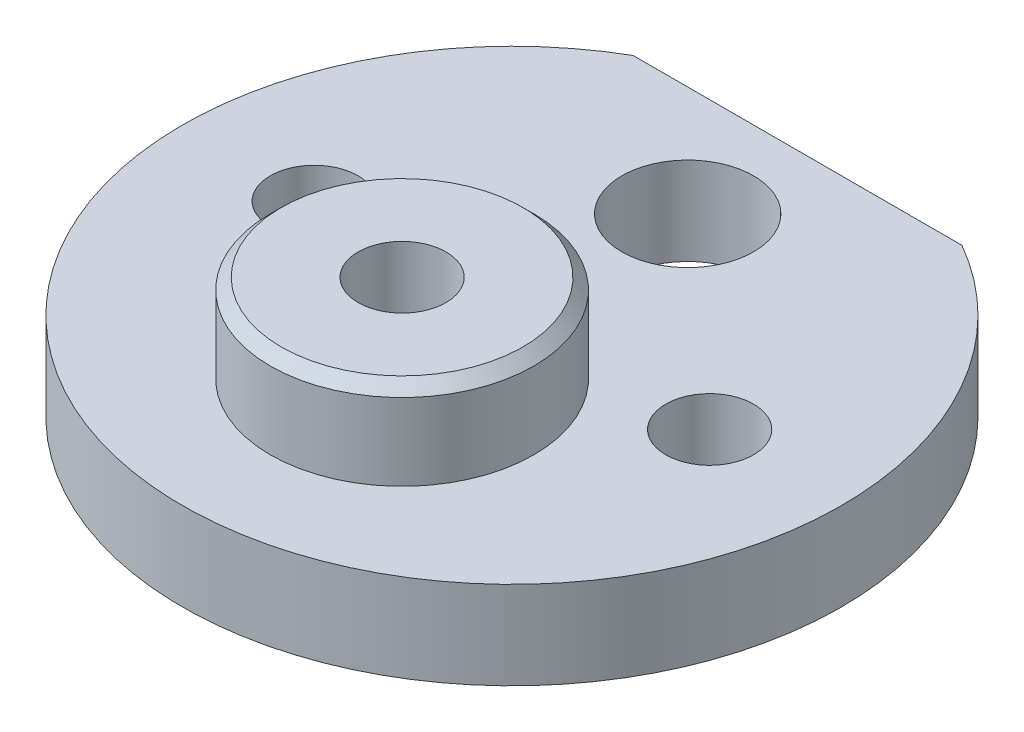
ISO-10303-21;
HEADER;
FILE_DESCRIPTION(('STEP AP214'),'2;1');
FILE_NAME('part.step','',(''),(''),'','','');
FILE_SCHEMA(('AUTOMOTIVE_DESIGN { 1 0 10303 214 1 1 1 1 }'));
ENDSEC;
DATA;
#1=APPLICATION_CONTEXT('core data for automotive mechanical design processes');
#2=APPLICATION_PROTOCOL_DEFINITION('international standard','automotive_design',2000,#1);
#3=PRODUCT_CONTEXT('',#1,'mechanical');
#4=PRODUCT('Part','Part','',(#3));
#5=PRODUCT_RELATED_PRODUCT_CATEGORY('part','',(#4));
#6=PRODUCT_DEFINITION_FORMATION('','',#4);
#7=PRODUCT_DEFINITION_CONTEXT('part definition',#1,'design');
#8=PRODUCT_DEFINITION('design','',#6,#7);
#9=PRODUCT_DEFINITION_SHAPE('','',#8);
#10=(LENGTH_UNIT() NAMED_UNIT(*) SI_UNIT(.MILLI.,.METRE.));
#11=(NAMED_UNIT(*) PLANE_ANGLE_UNIT() SI_UNIT($,.RADIAN.));
#12=(NAMED_UNIT(*) SI_UNIT($,.STERADIAN.) SOLID_ANGLE_UNIT());
#13=UNCERTAINTY_MEASURE_WITH_UNIT(LENGTH_MEASURE(1.E-05),#10,'distance_accuracy_value','');
#14=(GEOMETRIC_REPRESENTATION_CONTEXT(3) GLOBAL_UNCERTAINTY_ASSIGNED_CONTEXT((#13)) GLOBAL_UNIT_ASSIGNED_CONTEXT((#10,
#11,#12)) REPRESENTATION_CONTEXT('',''));
#15=CARTESIAN_POINT('',(0.,0.,0.));
#16=DIRECTION('',(0.,0.,1.));
#17=DIRECTION('',(1.,0.,0.));
#18=AXIS2_PLACEMENT_3D('',#15,#16,#17);
#19=CARTESIAN_POINT('',(0.,4.,0.));
#20=DIRECTION('',(0.,-1.,0.));
#21=DIRECTION('',(0.,0.,-1.));
#22=AXIS2_PLACEMENT_3D('',#19,#20,#21);
#23=CYLINDRICAL_SURFACE('',#22,15.);
#24=CARTESIAN_POINT('',(0.,0.,0.));
#25=DIRECTION('',(0.,1.,0.));
#26=DIRECTION('',(0.,0.,1.));
#27=AXIS2_PLACEMENT_3D('',#24,#25,#26);
#28=CIRCLE('',#27,15.);
#29=CARTESIAN_POINT('',(-7.48331477354788,0.,-13.));
#30=VERTEX_POINT('',#29);
#31=CARTESIAN_POINT('',(7.48331477354788,0.,-13.));
#32=VERTEX_POINT('',#31);
#33=EDGE_CURVE('E82',#30,#32,#28,.T.);
#34=ORIENTED_EDGE('',*,*,#33,.T.);
#35=DIRECTION('',(0.,-1.,0.));
#36=VECTOR('',#35,1.);
#37=CARTESIAN_POINT('',(7.48331477354788,4.,-13.));
#38=LINE('',#37,#36);
#39=CARTESIAN_POINT('',(7.48331477354788,4.,-13.));
#40=VERTEX_POINT('',#39);
#41=EDGE_CURVE('E78',#40,#32,#38,.T.);
#42=ORIENTED_EDGE('',*,*,#41,.F.);
#43=CARTESIAN_POINT('',(0.,4.,0.));
#44=DIRECTION('',(0.,1.,0.));
#45=DIRECTION('',(0.,0.,1.));
#46=AXIS2_PLACEMENT_3D('',#43,#44,#45);
#47=CIRCLE('',#46,15.);
#48=CARTESIAN_POINT('',(-7.48331477354788,4.,-13.));
#49=VERTEX_POINT('',#48);
#50=EDGE_CURVE('E81',#49,#40,#47,.T.);
#51=ORIENTED_EDGE('',*,*,#50,.F.);
#52=DIRECTION('',(0.,-1.,0.));
#53=VECTOR('',#52,1.);
#54=CARTESIAN_POINT('',(-7.48331477354788,4.,-13.));
#55=LINE('',#54,#53);
#56=EDGE_CURVE('E75',#49,#30,#55,.T.);
#57=ORIENTED_EDGE('',*,*,#56,.T.);
#58=EDGE_LOOP('',(#34,#42,#51,#57));
#59=FACE_BOUND('',#58,.T.);
#60=ADVANCED_FACE('F44',(#59),#23,.T.);
#61=CARTESIAN_POINT('',(-7.48331477354788,4.,-13.));
#62=DIRECTION('',(0.,0.,1.));
#63=DIRECTION('',(1.,0.,0.));
#64=AXIS2_PLACEMENT_3D('',#61,#62,#63);
#65=PLANE('',#64);
#66=DIRECTION('',(-1.,0.,0.));
#67=VECTOR('',#66,1.);
#68=CARTESIAN_POINT('',(-7.48331477354788,0.,-13.));
#69=LINE('',#68,#67);
#70=EDGE_CURVE('E70',#32,#30,#69,.T.);
#71=ORIENTED_EDGE('',*,*,#70,.T.);
#72=ORIENTED_EDGE('',*,*,#56,.F.);
#73=DIRECTION('',(-1.,0.,0.));
#74=VECTOR('',#73,1.);
#75=CARTESIAN_POINT('',(-7.48331477354788,4.,-13.));
#76=LINE('',#75,#74);
#77=EDGE_CURVE('E62',#40,#49,#76,.T.);
#78=ORIENTED_EDGE('',*,*,#77,.F.);
#79=ORIENTED_EDGE('',*,*,#41,.T.);
#80=EDGE_LOOP('',(#71,#72,#78,#79));
#81=FACE_BOUND('',#80,.T.);
#82=ADVANCED_FACE('F74',(#81),#65,.F.);
#83=CARTESIAN_POINT('',(0.,4.,0.));
#84=DIRECTION('',(0.,1.,0.));
#85=DIRECTION('',(0.,0.,1.));
#86=AXIS2_PLACEMENT_3D('',#83,#84,#85);
#87=PLANE('',#86);
#88=CARTESIAN_POINT('',(0.,4.,5.));
#89=DIRECTION('',(0.,1.,0.));
#90=DIRECTION('',(0.,0.,1.));
#91=AXIS2_PLACEMENT_3D('',#88,#89,#90);
#92=CIRCLE('',#91,6.);
#93=CARTESIAN_POINT('',(0.,4.,11.));
#94=VERTEX_POINT('',#93);
#95=EDGE_CURVE('E232',#94,#94,#92,.T.);
#96=ORIENTED_EDGE('',*,*,#95,.F.);
#97=EDGE_LOOP('',(#96));
#98=FACE_BOUND('',#97,.T.);
#99=CARTESIAN_POINT('',(0.,4.,-8.));
#100=DIRECTION('',(0.,1.,0.));
#101=DIRECTION('',(0.,0.,1.));
#102=AXIS2_PLACEMENT_3D('',#99,#100,#101);
#103=CIRCLE('',#102,3.);
#104=CARTESIAN_POINT('',(0.,4.,-5.));
#105=VERTEX_POINT('',#104);
#106=EDGE_CURVE('E93',#105,#105,#103,.T.);
#107=ORIENTED_EDGE('',*,*,#106,.F.);
#108=EDGE_LOOP('',(#107));
#109=FACE_BOUND('',#108,.T.);
#110=CARTESIAN_POINT('',(-9.,4.,0.));
#111=DIRECTION('',(0.,1.,0.));
#112=DIRECTION('',(0.,0.,1.));
#113=AXIS2_PLACEMENT_3D('',#110,#111,#112);
#114=CIRCLE('',#113,2.);
#115=CARTESIAN_POINT('',(-9.,4.,2.));
#116=VERTEX_POINT('',#115);
#117=EDGE_CURVE('E250',#116,#116,#114,.T.);
#118=ORIENTED_EDGE('',*,*,#117,.F.);
#119=EDGE_LOOP('',(#118));
#120=FACE_BOUND('',#119,.T.);
#121=CARTESIAN_POINT('',(9.,4.,0.));
#122=DIRECTION('',(0.,1.,0.));
#123=DIRECTION('',(0.,0.,1.));
#124=AXIS2_PLACEMENT_3D('',#121,#122,#123);
#125=CIRCLE('',#124,2.);
#126=CARTESIAN_POINT('',(9.,4.,2.));
#127=VERTEX_POINT('',#126);
#128=EDGE_CURVE('E240',#127,#127,#125,.T.);
#129=ORIENTED_EDGE('',*,*,#128,.F.);
#130=EDGE_LOOP('',(#129));
#131=FACE_BOUND('',#130,.T.);
#132=ORIENTED_EDGE('',*,*,#50,.T.);
#133=ORIENTED_EDGE('',*,*,#77,.T.);
#134=EDGE_LOOP('',(#132,#133));
#135=FACE_BOUND('',#134,.T.);
#136=ADVANCED_FACE('F119',(#98,#109,#120,#131,#135),#87,.T.);
#137=CARTESIAN_POINT('',(0.,0.,0.));
#138=DIRECTION('',(0.,1.,0.));
#139=DIRECTION('',(0.,0.,1.));
#140=AXIS2_PLACEMENT_3D('',#137,#138,#139);
#141=PLANE('',#140);
#142=CARTESIAN_POINT('',(0.,0.,5.));
#143=DIRECTION('',(0.,1.,0.));
#144=DIRECTION('',(0.,0.,1.));
#145=AXIS2_PLACEMENT_3D('',#142,#143,#144);
#146=CIRCLE('',#145,2.);
#147=CARTESIAN_POINT('',(0.,0.,7.));
#148=VERTEX_POINT('',#147);
#149=EDGE_CURVE('E235',#148,#148,#146,.T.);
#150=ORIENTED_EDGE('',*,*,#149,.T.);
#151=EDGE_LOOP('',(#150));
#152=FACE_BOUND('',#151,.T.);
#153=CARTESIAN_POINT('',(0.,0.,-8.));
#154=DIRECTION('',(0.,1.,0.));
#155=DIRECTION('',(0.,0.,1.));
#156=AXIS2_PLACEMENT_3D('',#153,#154,#155);
#157=CIRCLE('',#156,3.);
#158=CARTESIAN_POINT('',(0.,0.,-5.));
#159=VERTEX_POINT('',#158);
#160=EDGE_CURVE('E89',#159,#159,#157,.T.);
#161=ORIENTED_EDGE('',*,*,#160,.T.);
#162=EDGE_LOOP('',(#161));
#163=FACE_BOUND('',#162,.T.);
#164=CARTESIAN_POINT('',(-9.,0.,0.));
#165=DIRECTION('',(0.,1.,0.));
#166=DIRECTION('',(0.,0.,1.));
#167=AXIS2_PLACEMENT_3D('',#164,#165,#166);
#168=CIRCLE('',#167,2.);
#169=CARTESIAN_POINT('',(-9.,0.,2.));
#170=VERTEX_POINT('',#169);
#171=EDGE_CURVE('E254',#170,#170,#168,.T.);
#172=ORIENTED_EDGE('',*,*,#171,.T.);
#173=EDGE_LOOP('',(#172));
#174=FACE_BOUND('',#173,.T.);
#175=CARTESIAN_POINT('',(9.,0.,0.));
#176=DIRECTION('',(0.,1.,0.));
#177=DIRECTION('',(0.,0.,1.));
#178=AXIS2_PLACEMENT_3D('',#175,#176,#177);
#179=CIRCLE('',#178,2.);
#180=CARTESIAN_POINT('',(9.,0.,2.));
#181=VERTEX_POINT('',#180);
#182=EDGE_CURVE('E234',#181,#181,#179,.T.);
#183=ORIENTED_EDGE('',*,*,#182,.T.);
#184=EDGE_LOOP('',(#183));
#185=FACE_BOUND('',#184,.T.);
#186=ORIENTED_EDGE('',*,*,#33,.F.);
#187=ORIENTED_EDGE('',*,*,#70,.F.);
#188=EDGE_LOOP('',(#186,#187));
#189=FACE_BOUND('',#188,.T.);
#190=ADVANCED_FACE('F87',(#152,#163,#174,#185,#189),#141,.F.);
#191=CARTESIAN_POINT('',(9.,0.,0.));
#192=DIRECTION('',(0.,1.,0.));
#193=DIRECTION('',(0.,0.,1.));
#194=AXIS2_PLACEMENT_3D('',#191,#192,#193);
#195=CYLINDRICAL_SURFACE('',#194,2.);
#196=ORIENTED_EDGE('',*,*,#182,.F.);
#197=EDGE_LOOP('',(#196));
#198=FACE_BOUND('',#197,.T.);
#199=ORIENTED_EDGE('',*,*,#128,.T.);
#200=EDGE_LOOP('',(#199));
#201=FACE_BOUND('',#200,.T.);
#202=ADVANCED_FACE('F124',(#198,#201),#195,.F.);
#203=CARTESIAN_POINT('',(-9.,0.,0.));
#204=DIRECTION('',(0.,1.,0.));
#205=DIRECTION('',(0.,0.,1.));
#206=AXIS2_PLACEMENT_3D('',#203,#204,#205);
#207=CYLINDRICAL_SURFACE('',#206,2.);
#208=ORIENTED_EDGE('',*,*,#171,.F.);
#209=EDGE_LOOP('',(#208));
#210=FACE_BOUND('',#209,.T.);
#211=ORIENTED_EDGE('',*,*,#117,.T.);
#212=EDGE_LOOP('',(#211));
#213=FACE_BOUND('',#212,.T.);
#214=ADVANCED_FACE('F131',(#210,#213),#207,.F.);
#215=CARTESIAN_POINT('',(0.,0.,-8.));
#216=DIRECTION('',(0.,1.,0.));
#217=DIRECTION('',(0.,0.,1.));
#218=AXIS2_PLACEMENT_3D('',#215,#216,#217);
#219=CYLINDRICAL_SURFACE('',#218,3.);
#220=ORIENTED_EDGE('',*,*,#160,.F.);
#221=EDGE_LOOP('',(#220));
#222=FACE_BOUND('',#221,.T.);
#223=ORIENTED_EDGE('',*,*,#106,.T.);
#224=EDGE_LOOP('',(#223));
#225=FACE_BOUND('',#224,.T.);
#226=ADVANCED_FACE('F135',(#222,#225),#219,.F.);
#227=CARTESIAN_POINT('',(0.,8.,5.));
#228=DIRECTION('',(0.,-1.,0.));
#229=DIRECTION('',(0.,0.,-1.));
#230=AXIS2_PLACEMENT_3D('',#227,#228,#229);
#231=CYLINDRICAL_SURFACE('',#230,6.);
#232=CARTESIAN_POINT('',(0.,7.5,5.));
#233=DIRECTION('',(0.,1.,0.));
#234=DIRECTION('',(0.,0.,1.));
#235=AXIS2_PLACEMENT_3D('',#232,#233,#234);
#236=CIRCLE('',#235,6.);
#237=CARTESIAN_POINT('',(0.,7.5,11.));
#238=VERTEX_POINT('',#237);
#239=EDGE_CURVE('E11',#238,#238,#236,.F.);
#240=ORIENTED_EDGE('',*,*,#239,.T.);
#241=EDGE_LOOP('',(#240));
#242=FACE_BOUND('',#241,.T.);
#243=ORIENTED_EDGE('',*,*,#95,.T.);
#244=EDGE_LOOP('',(#243));
#245=FACE_BOUND('',#244,.T.);
#246=ADVANCED_FACE('F139',(#242,#245),#231,.T.);
#247=CARTESIAN_POINT('',(0.,8.,5.));
#248=DIRECTION('',(0.,1.,0.));
#249=DIRECTION('',(0.,0.,1.));
#250=AXIS2_PLACEMENT_3D('',#247,#248,#249);
#251=PLANE('',#250);
#252=CARTESIAN_POINT('',(0.,8.,5.));
#253=DIRECTION('',(0.,1.,0.));
#254=DIRECTION('',(0.,0.,1.));
#255=AXIS2_PLACEMENT_3D('',#252,#253,#254);
#256=CIRCLE('',#255,5.50000000000001);
#257=CARTESIAN_POINT('',(0.,8.,10.5));
#258=VERTEX_POINT('',#257);
#259=EDGE_CURVE('E55',#258,#258,#256,.T.);
#260=ORIENTED_EDGE('',*,*,#259,.T.);
#261=EDGE_LOOP('',(#260));
#262=FACE_BOUND('',#261,.T.);
#263=CARTESIAN_POINT('',(0.,8.,5.));
#264=DIRECTION('',(0.,1.,0.));
#265=DIRECTION('',(0.,0.,1.));
#266=AXIS2_PLACEMENT_3D('',#263,#264,#265);
#267=CIRCLE('',#266,2.);
#268=CARTESIAN_POINT('',(0.,8.,7.));
#269=VERTEX_POINT('',#268);
#270=EDGE_CURVE('E243',#269,#269,#267,.T.);
#271=ORIENTED_EDGE('',*,*,#270,.F.);
#272=EDGE_LOOP('',(#271));
#273=FACE_BOUND('',#272,.T.);
#274=ADVANCED_FACE('F103',(#262,#273),#251,.T.);
#275=CARTESIAN_POINT('',(0.,0.,5.));
#276=DIRECTION('',(0.,1.,0.));
#277=DIRECTION('',(0.,0.,1.));
#278=AXIS2_PLACEMENT_3D('',#275,#276,#277);
#279=CYLINDRICAL_SURFACE('',#278,2.);
#280=ORIENTED_EDGE('',*,*,#149,.F.);
#281=EDGE_LOOP('',(#280));
#282=FACE_BOUND('',#281,.T.);
#283=ORIENTED_EDGE('',*,*,#270,.T.);
#284=EDGE_LOOP('',(#283));
#285=FACE_BOUND('',#284,.T.);
#286=ADVANCED_FACE('F107',(#282,#285),#279,.F.);
#287=CARTESIAN_POINT('',(0.,8.,5.));
#288=DIRECTION('',(0.,-1.,0.));
#289=DIRECTION('',(0.,0.,-1.));
#290=AXIS2_PLACEMENT_3D('',#287,#288,#289);
#291=CONICAL_SURFACE('',#290,5.50000000000001,0.785398163397447);
#292=ORIENTED_EDGE('',*,*,#239,.F.);
#293=EDGE_LOOP('',(#292));
#294=FACE_BOUND('',#293,.T.);
#295=ORIENTED_EDGE('',*,*,#259,.F.);
#296=EDGE_LOOP('',(#295));
#297=FACE_BOUND('',#296,.T.);
#298=ADVANCED_FACE('F47',(#294,#297),#291,.T.);
#299=CLOSED_SHELL('',(#60,#82,#136,#190,#202,#214,#226,#246,#274,#286,#298));
#300=MANIFOLD_SOLID_BREP('B2',#299);
#301=ADVANCED_BREP_SHAPE_REPRESENTATION('',(#18,#300),#14);
#302=SHAPE_DEFINITION_REPRESENTATION(#9,#301);
ENDSEC;
END-ISO-10303-21;
